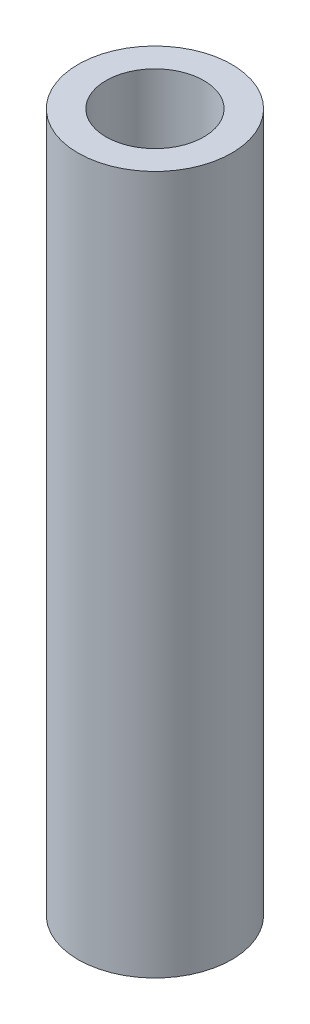
ISO-10303-21;
HEADER;
FILE_DESCRIPTION(('STEP AP214'),'2;1');
FILE_NAME('part.step','',(''),(''),'','','');
FILE_SCHEMA(('AUTOMOTIVE_DESIGN { 1 0 10303 214 1 1 1 1 }'));
ENDSEC;
DATA;
#1=APPLICATION_CONTEXT('core data for automotive mechanical design processes');
#2=APPLICATION_PROTOCOL_DEFINITION('international standard','automotive_design',2000,#1);
#3=PRODUCT_CONTEXT('',#1,'mechanical');
#4=PRODUCT('Part','Part','',(#3));
#5=PRODUCT_RELATED_PRODUCT_CATEGORY('part','',(#4));
#6=PRODUCT_DEFINITION_FORMATION('','',#4);
#7=PRODUCT_DEFINITION_CONTEXT('part definition',#1,'design');
#8=PRODUCT_DEFINITION('design','',#6,#7);
#9=PRODUCT_DEFINITION_SHAPE('','',#8);
#10=(LENGTH_UNIT() NAMED_UNIT(*) SI_UNIT(.MILLI.,.METRE.));
#11=(NAMED_UNIT(*) PLANE_ANGLE_UNIT() SI_UNIT($,.RADIAN.));
#12=(NAMED_UNIT(*) SI_UNIT($,.STERADIAN.) SOLID_ANGLE_UNIT());
#13=UNCERTAINTY_MEASURE_WITH_UNIT(LENGTH_MEASURE(1.E-05),#10,'distance_accuracy_value','');
#14=(GEOMETRIC_REPRESENTATION_CONTEXT(3) GLOBAL_UNCERTAINTY_ASSIGNED_CONTEXT((#13)) GLOBAL_UNIT_ASSIGNED_CONTEXT((#10,
#11,#12)) REPRESENTATION_CONTEXT('',''));
#15=CARTESIAN_POINT('',(0.,0.,0.));
#16=DIRECTION('',(0.,0.,1.));
#17=DIRECTION('',(1.,0.,0.));
#18=AXIS2_PLACEMENT_3D('',#15,#16,#17);
#19=CARTESIAN_POINT('',(0.,25.,0.));
#20=DIRECTION('',(0.,1.,0.));
#21=DIRECTION('',(0.,0.,1.));
#22=AXIS2_PLACEMENT_3D('',#19,#20,#21);
#23=PLANE('',#22);
#24=CARTESIAN_POINT('',(0.,25.,0.));
#25=DIRECTION('',(0.,1.,0.));
#26=DIRECTION('',(0.,0.,1.));
#27=AXIS2_PLACEMENT_3D('',#24,#25,#26);
#28=CIRCLE('',#27,2.75);
#29=CARTESIAN_POINT('',(0.,25.,2.75));
#30=VERTEX_POINT('',#29);
#31=EDGE_CURVE('E10',#30,#30,#28,.T.);
#32=ORIENTED_EDGE('',*,*,#31,.T.);
#33=EDGE_LOOP('',(#32));
#34=FACE_BOUND('',#33,.T.);
#35=CARTESIAN_POINT('',(0.,25.,0.));
#36=DIRECTION('',(0.,1.,0.));
#37=DIRECTION('',(0.,0.,1.));
#38=AXIS2_PLACEMENT_3D('',#35,#36,#37);
#39=CIRCLE('',#38,1.75);
#40=CARTESIAN_POINT('',(0.,25.,1.75));
#41=VERTEX_POINT('',#40);
#42=EDGE_CURVE('E42',#41,#41,#39,.T.);
#43=ORIENTED_EDGE('',*,*,#42,.F.);
#44=EDGE_LOOP('',(#43));
#45=FACE_BOUND('',#44,.T.);
#46=ADVANCED_FACE('F31',(#34,#45),#23,.T.);
#47=CARTESIAN_POINT('',(0.,0.,0.));
#48=DIRECTION('',(0.,1.,0.));
#49=DIRECTION('',(0.,0.,1.));
#50=AXIS2_PLACEMENT_3D('',#47,#48,#49);
#51=PLANE('',#50);
#52=CARTESIAN_POINT('',(0.,0.,0.));
#53=DIRECTION('',(0.,1.,0.));
#54=DIRECTION('',(0.,0.,1.));
#55=AXIS2_PLACEMENT_3D('',#52,#53,#54);
#56=CIRCLE('',#55,2.75);
#57=CARTESIAN_POINT('',(0.,0.,2.75));
#58=VERTEX_POINT('',#57);
#59=EDGE_CURVE('E35',#58,#58,#56,.T.);
#60=ORIENTED_EDGE('',*,*,#59,.F.);
#61=EDGE_LOOP('',(#60));
#62=FACE_BOUND('',#61,.T.);
#63=CARTESIAN_POINT('',(0.,0.,0.));
#64=DIRECTION('',(0.,1.,0.));
#65=DIRECTION('',(0.,0.,1.));
#66=AXIS2_PLACEMENT_3D('',#63,#64,#65);
#67=CIRCLE('',#66,1.75);
#68=CARTESIAN_POINT('',(0.,0.,1.75));
#69=VERTEX_POINT('',#68);
#70=EDGE_CURVE('E44',#69,#69,#67,.T.);
#71=ORIENTED_EDGE('',*,*,#70,.T.);
#72=EDGE_LOOP('',(#71));
#73=FACE_BOUND('',#72,.T.);
#74=ADVANCED_FACE('F54',(#62,#73),#51,.F.);
#75=CARTESIAN_POINT('',(0.,25.,0.));
#76=DIRECTION('',(0.,-1.,0.));
#77=DIRECTION('',(0.,0.,-1.));
#78=AXIS2_PLACEMENT_3D('',#75,#76,#77);
#79=CYLINDRICAL_SURFACE('',#78,2.75);
#80=ORIENTED_EDGE('',*,*,#31,.F.);
#81=EDGE_LOOP('',(#80));
#82=FACE_BOUND('',#81,.T.);
#83=ORIENTED_EDGE('',*,*,#59,.T.);
#84=EDGE_LOOP('',(#83));
#85=FACE_BOUND('',#84,.T.);
#86=ADVANCED_FACE('F33',(#82,#85),#79,.T.);
#87=CARTESIAN_POINT('',(0.,25.,0.));
#88=DIRECTION('',(0.,-1.,0.));
#89=DIRECTION('',(0.,0.,-1.));
#90=AXIS2_PLACEMENT_3D('',#87,#88,#89);
#91=CYLINDRICAL_SURFACE('',#90,1.75);
#92=ORIENTED_EDGE('',*,*,#42,.T.);
#93=EDGE_LOOP('',(#92));
#94=FACE_BOUND('',#93,.T.);
#95=ORIENTED_EDGE('',*,*,#70,.F.);
#96=EDGE_LOOP('',(#95));
#97=FACE_BOUND('',#96,.T.);
#98=ADVANCED_FACE('F50',(#94,#97),#91,.F.);
#99=CLOSED_SHELL('',(#46,#74,#86,#98));
#100=MANIFOLD_SOLID_BREP('B2',#99);
#101=ADVANCED_BREP_SHAPE_REPRESENTATION('',(#18,#100),#14);
#102=SHAPE_DEFINITION_REPRESENTATION(#9,#101);
ENDSEC;
END-ISO-10303-21;
